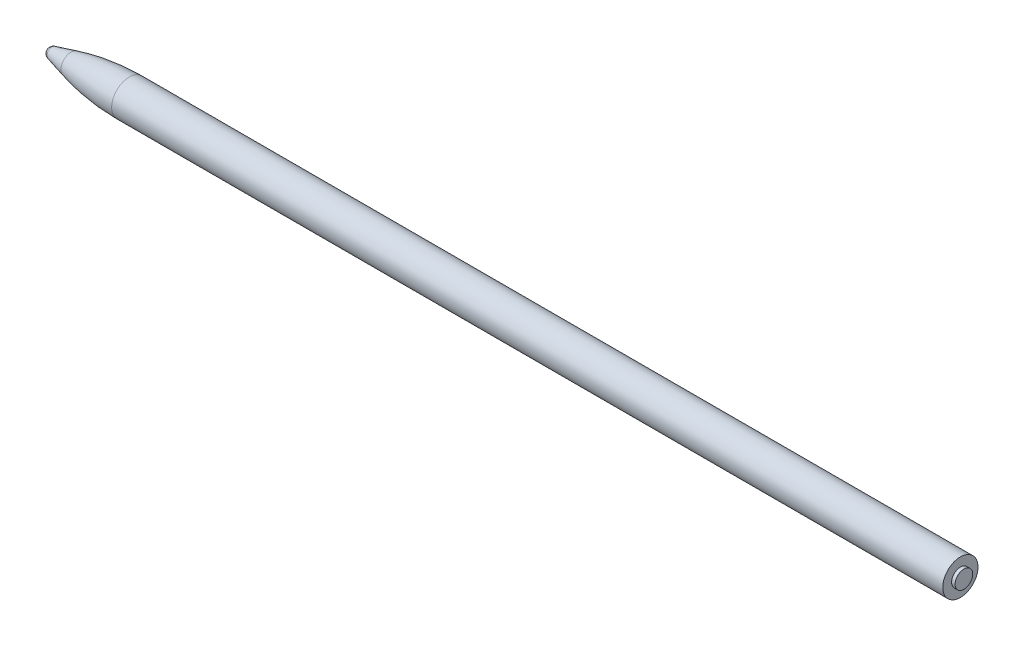
ISO-10303-21;
HEADER;
FILE_DESCRIPTION(('STEP AP214'),'2;1');
FILE_NAME('part.step','',(''),(''),'','','');
FILE_SCHEMA(('AUTOMOTIVE_DESIGN { 1 0 10303 214 1 1 1 1 }'));
ENDSEC;
DATA;
#1=APPLICATION_CONTEXT('core data for automotive mechanical design processes');
#2=APPLICATION_PROTOCOL_DEFINITION('international standard','automotive_design',2000,#1);
#3=PRODUCT_CONTEXT('',#1,'mechanical');
#4=PRODUCT('Part','Part','',(#3));
#5=PRODUCT_RELATED_PRODUCT_CATEGORY('part','',(#4));
#6=PRODUCT_DEFINITION_FORMATION('','',#4);
#7=PRODUCT_DEFINITION_CONTEXT('part definition',#1,'design');
#8=PRODUCT_DEFINITION('design','',#6,#7);
#9=PRODUCT_DEFINITION_SHAPE('','',#8);
#10=(LENGTH_UNIT() NAMED_UNIT(*) SI_UNIT(.MILLI.,.METRE.));
#11=(NAMED_UNIT(*) PLANE_ANGLE_UNIT() SI_UNIT($,.RADIAN.));
#12=(NAMED_UNIT(*) SI_UNIT($,.STERADIAN.) SOLID_ANGLE_UNIT());
#13=UNCERTAINTY_MEASURE_WITH_UNIT(LENGTH_MEASURE(1.E-05),#10,'distance_accuracy_value','');
#14=(GEOMETRIC_REPRESENTATION_CONTEXT(3) GLOBAL_UNCERTAINTY_ASSIGNED_CONTEXT((#13)) GLOBAL_UNIT_ASSIGNED_CONTEXT((#10,
#11,#12)) REPRESENTATION_CONTEXT('',''));
#15=CARTESIAN_POINT('',(0.,0.,0.));
#16=DIRECTION('',(0.,0.,1.));
#17=DIRECTION('',(1.,0.,0.));
#18=AXIS2_PLACEMENT_3D('',#15,#16,#17);
#19=CARTESIAN_POINT('',(0.,0.,0.));
#20=DIRECTION('',(1.,0.,0.));
#21=DIRECTION('',(0.,1.,0.));
#22=AXIS2_PLACEMENT_3D('',#19,#20,#21);
#23=PLANE('',#22);
#24=CARTESIAN_POINT('',(0.,0.,0.));
#25=DIRECTION('',(1.,0.,0.));
#26=DIRECTION('',(0.,1.,0.));
#27=AXIS2_PLACEMENT_3D('',#24,#25,#26);
#28=CIRCLE('',#27,0.5);
#29=CARTESIAN_POINT('',(0.,0.5,0.));
#30=VERTEX_POINT('',#29);
#31=EDGE_CURVE('E10',#30,#30,#28,.T.);
#32=ORIENTED_EDGE('',*,*,#31,.T.);
#33=EDGE_LOOP('',(#32));
#34=FACE_BOUND('',#33,.T.);
#35=ADVANCED_FACE('F43',(#34),#23,.T.);
#36=CARTESIAN_POINT('',(0.,0.,0.));
#37=DIRECTION('',(1.,0.,0.));
#38=DIRECTION('',(0.,1.,0.));
#39=AXIS2_PLACEMENT_3D('',#36,#37,#38);
#40=CYLINDRICAL_SURFACE('',#39,0.5);
#41=CARTESIAN_POINT('',(-0.2,0.,0.));
#42=DIRECTION('',(1.,0.,0.));
#43=DIRECTION('',(0.,1.,0.));
#44=AXIS2_PLACEMENT_3D('',#41,#42,#43);
#45=CIRCLE('',#44,0.5);
#46=CARTESIAN_POINT('',(-0.2,0.5,0.));
#47=VERTEX_POINT('',#46);
#48=EDGE_CURVE('E50',#47,#47,#45,.T.);
#49=ORIENTED_EDGE('',*,*,#48,.T.);
#50=EDGE_LOOP('',(#49));
#51=FACE_BOUND('',#50,.T.);
#52=ORIENTED_EDGE('',*,*,#31,.F.);
#53=EDGE_LOOP('',(#52));
#54=FACE_BOUND('',#53,.T.);
#55=ADVANCED_FACE('F87',(#51,#54),#40,.T.);
#56=CARTESIAN_POINT('',(-0.2,0.5,0.));
#57=DIRECTION('',(1.,0.,0.));
#58=DIRECTION('',(0.,1.,0.));
#59=AXIS2_PLACEMENT_3D('',#56,#57,#58);
#60=PLANE('',#59);
#61=CARTESIAN_POINT('',(-0.2,0.,0.));
#62=DIRECTION('',(1.,0.,0.));
#63=DIRECTION('',(0.,1.,0.));
#64=AXIS2_PLACEMENT_3D('',#61,#62,#63);
#65=CIRCLE('',#64,1.00000000000001);
#66=CARTESIAN_POINT('',(-0.2,1.00000000000001,0.));
#67=VERTEX_POINT('',#66);
#68=EDGE_CURVE('E55',#67,#67,#65,.T.);
#69=ORIENTED_EDGE('',*,*,#68,.T.);
#70=EDGE_LOOP('',(#69));
#71=FACE_BOUND('',#70,.T.);
#72=ORIENTED_EDGE('',*,*,#48,.F.);
#73=EDGE_LOOP('',(#72));
#74=FACE_BOUND('',#73,.T.);
#75=ADVANCED_FACE('F91',(#71,#74),#60,.T.);
#76=CARTESIAN_POINT('',(0.,0.,0.));
#77=DIRECTION('',(1.,0.,0.));
#78=DIRECTION('',(0.,1.,0.));
#79=AXIS2_PLACEMENT_3D('',#76,#77,#78);
#80=CYLINDRICAL_SURFACE('',#79,1.00000000000001);
#81=CARTESIAN_POINT('',(-47.3955441624846,0.,0.));
#82=DIRECTION('',(1.,0.,0.));
#83=DIRECTION('',(0.,1.,0.));
#84=AXIS2_PLACEMENT_3D('',#81,#82,#83);
#85=CIRCLE('',#84,1.00000000000001);
#86=CARTESIAN_POINT('',(-47.3955441624846,1.,0.));
#87=VERTEX_POINT('',#86);
#88=EDGE_CURVE('E60',#87,#87,#85,.T.);
#89=ORIENTED_EDGE('',*,*,#88,.T.);
#90=EDGE_LOOP('',(#89));
#91=FACE_BOUND('',#90,.T.);
#92=ORIENTED_EDGE('',*,*,#68,.F.);
#93=EDGE_LOOP('',(#92));
#94=FACE_BOUND('',#93,.T.);
#95=ADVANCED_FACE('F95',(#91,#94),#80,.T.);
#96=CARTESIAN_POINT('',(-47.3955441624846,0.,0.));
#97=DIRECTION('',(1.,0.,0.));
#98=DIRECTION('',(0.,1.,0.));
#99=AXIS2_PLACEMENT_3D('',#96,#97,#98);
#100=DEGENERATE_TOROIDAL_SURFACE('',#99,12.,13.,.F.);
#101=CARTESIAN_POINT('',(-50.7,0.,0.));
#102=DIRECTION('',(1.,0.,0.));
#103=DIRECTION('',(0.,1.,0.));
#104=AXIS2_PLACEMENT_3D('',#101,#102,#103);
#105=CIRCLE('',#104,0.573009648366227);
#106=CARTESIAN_POINT('',(-50.7,0.573009648366221,0.));
#107=VERTEX_POINT('',#106);
#108=EDGE_CURVE('E66',#107,#107,#105,.T.);
#109=ORIENTED_EDGE('',*,*,#108,.T.);
#110=EDGE_LOOP('',(#109));
#111=FACE_BOUND('',#110,.T.);
#112=ORIENTED_EDGE('',*,*,#88,.F.);
#113=EDGE_LOOP('',(#112));
#114=FACE_BOUND('',#113,.T.);
#115=ADVANCED_FACE('F84',(#111,#114),#100,.F.);
#116=CARTESIAN_POINT('',(-50.7,0.,0.));
#117=DIRECTION('',(1.,0.,0.));
#118=DIRECTION('',(0.,1.,0.));
#119=AXIS2_PLACEMENT_3D('',#116,#117,#118);
#120=CONICAL_SURFACE('',#119,0.573009648366227,0.25700897594148);
#121=CARTESIAN_POINT('',(-51.7762566731734,0.,0.));
#122=DIRECTION('',(1.,0.,0.));
#123=DIRECTION('',(0.,1.,0.));
#124=AXIS2_PLACEMENT_3D('',#121,#122,#123);
#125=CIRCLE('',#124,0.290146376500762);
#126=CARTESIAN_POINT('',(-51.7762566731734,0.290146376500756,0.));
#127=VERTEX_POINT('',#126);
#128=EDGE_CURVE('E70',#127,#127,#125,.T.);
#129=ORIENTED_EDGE('',*,*,#128,.T.);
#130=EDGE_LOOP('',(#129));
#131=FACE_BOUND('',#130,.T.);
#132=ORIENTED_EDGE('',*,*,#108,.F.);
#133=EDGE_LOOP('',(#132));
#134=FACE_BOUND('',#133,.T.);
#135=ADVANCED_FACE('F75',(#131,#134),#120,.T.);
#136=CARTESIAN_POINT('',(-51.7,0.,0.));
#137=DIRECTION('',(1.,0.,0.));
#138=DIRECTION('',(0.,1.,0.));
#139=AXIS2_PLACEMENT_3D('',#136,#137,#138);
#140=SPHERICAL_SURFACE('',#139,0.300000000000002);
#141=ORIENTED_EDGE('',*,*,#128,.F.);
#142=EDGE_LOOP('',(#141));
#143=FACE_BOUND('',#142,.T.);
#144=ADVANCED_FACE('F78',(#143),#140,.T.);
#145=CLOSED_SHELL('',(#35,#55,#75,#95,#115,#135,#144));
#146=MANIFOLD_SOLID_BREP('B2',#145);
#147=ADVANCED_BREP_SHAPE_REPRESENTATION('',(#18,#146),#14);
#148=SHAPE_DEFINITION_REPRESENTATION(#9,#147);
ENDSEC;
END-ISO-10303-21;
